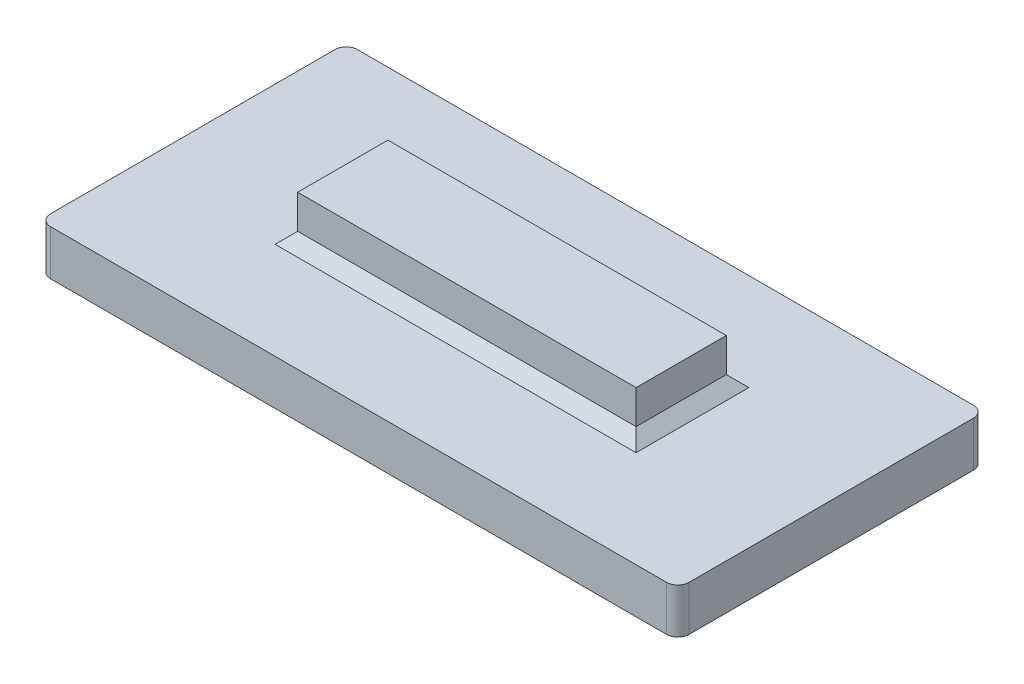
ISO-10303-21;
HEADER;
FILE_DESCRIPTION(('STEP AP214'),'2;1');
FILE_NAME('part.step','',(''),(''),'','','');
FILE_SCHEMA(('AUTOMOTIVE_DESIGN { 1 0 10303 214 1 1 1 1 }'));
ENDSEC;
DATA;
#1=APPLICATION_CONTEXT('core data for automotive mechanical design processes');
#2=APPLICATION_PROTOCOL_DEFINITION('international standard','automotive_design',2000,#1);
#3=PRODUCT_CONTEXT('',#1,'mechanical');
#4=PRODUCT('Part','Part','',(#3));
#5=PRODUCT_RELATED_PRODUCT_CATEGORY('part','',(#4));
#6=PRODUCT_DEFINITION_FORMATION('','',#4);
#7=PRODUCT_DEFINITION_CONTEXT('part definition',#1,'design');
#8=PRODUCT_DEFINITION('design','',#6,#7);
#9=PRODUCT_DEFINITION_SHAPE('','',#8);
#10=(LENGTH_UNIT() NAMED_UNIT(*) SI_UNIT(.MILLI.,.METRE.));
#11=(NAMED_UNIT(*) PLANE_ANGLE_UNIT() SI_UNIT($,.RADIAN.));
#12=(NAMED_UNIT(*) SI_UNIT($,.STERADIAN.) SOLID_ANGLE_UNIT());
#13=UNCERTAINTY_MEASURE_WITH_UNIT(LENGTH_MEASURE(1.E-05),#10,'distance_accuracy_value','');
#14=(GEOMETRIC_REPRESENTATION_CONTEXT(3) GLOBAL_UNCERTAINTY_ASSIGNED_CONTEXT((#13)) GLOBAL_UNIT_ASSIGNED_CONTEXT((#10,
#11,#12)) REPRESENTATION_CONTEXT('',''));
#15=CARTESIAN_POINT('',(0.,0.,0.));
#16=DIRECTION('',(0.,0.,1.));
#17=DIRECTION('',(1.,0.,0.));
#18=AXIS2_PLACEMENT_3D('',#15,#16,#17);
#19=CARTESIAN_POINT('',(0.,2.,0.));
#20=DIRECTION('',(0.,-1.,0.));
#21=DIRECTION('',(0.,0.,-1.));
#22=AXIS2_PLACEMENT_3D('',#19,#20,#21);
#23=PLANE('',#22);
#24=DIRECTION('',(-1.,0.,0.));
#25=VECTOR('',#24,1.);
#26=CARTESIAN_POINT('',(-7.5,2.,2.5));
#27=LINE('',#26,#25);
#28=CARTESIAN_POINT('',(8.,2.,2.5));
#29=VERTEX_POINT('',#28);
#30=CARTESIAN_POINT('',(-8.,2.,2.5));
#31=VERTEX_POINT('',#30);
#32=EDGE_CURVE('E226',#29,#31,#27,.T.);
#33=ORIENTED_EDGE('',*,*,#32,.T.);
#34=DIRECTION('',(0.,0.,-1.));
#35=VECTOR('',#34,1.);
#36=CARTESIAN_POINT('',(-8.,2.,-2.));
#37=LINE('',#36,#35);
#38=CARTESIAN_POINT('',(-8.,2.,-2.5));
#39=VERTEX_POINT('',#38);
#40=EDGE_CURVE('E228',#31,#39,#37,.T.);
#41=ORIENTED_EDGE('',*,*,#40,.T.);
#42=DIRECTION('',(1.,0.,0.));
#43=VECTOR('',#42,1.);
#44=CARTESIAN_POINT('',(7.5,2.,-2.5));
#45=LINE('',#44,#43);
#46=CARTESIAN_POINT('',(8.,2.,-2.5));
#47=VERTEX_POINT('',#46);
#48=EDGE_CURVE('E222',#39,#47,#45,.T.);
#49=ORIENTED_EDGE('',*,*,#48,.T.);
#50=DIRECTION('',(0.,0.,1.));
#51=VECTOR('',#50,1.);
#52=CARTESIAN_POINT('',(8.,2.,2.));
#53=LINE('',#52,#51);
#54=EDGE_CURVE('E224',#47,#29,#53,.T.);
#55=ORIENTED_EDGE('',*,*,#54,.T.);
#56=EDGE_LOOP('',(#33,#41,#49,#55));
#57=FACE_BOUND('',#56,.T.);
#58=DIRECTION('',(1.,0.,0.));
#59=VECTOR('',#58,1.);
#60=CARTESIAN_POINT('',(-14.15,2.,6.8));
#61=LINE('',#60,#59);
#62=CARTESIAN_POINT('',(-13.65,2.,6.8));
#63=VERTEX_POINT('',#62);
#64=CARTESIAN_POINT('',(13.65,2.,6.8));
#65=VERTEX_POINT('',#64);
#66=EDGE_CURVE('E173',#63,#65,#61,.T.);
#67=ORIENTED_EDGE('',*,*,#66,.T.);
#68=CARTESIAN_POINT('',(13.65,2.,6.3));
#69=DIRECTION('',(0.,-1.,0.));
#70=DIRECTION('',(0.,0.,-1.));
#71=AXIS2_PLACEMENT_3D('',#68,#69,#70);
#72=CIRCLE('',#71,0.5);
#73=CARTESIAN_POINT('',(14.15,2.,6.3));
#74=VERTEX_POINT('',#73);
#75=EDGE_CURVE('E207',#65,#74,#72,.F.);
#76=ORIENTED_EDGE('',*,*,#75,.T.);
#77=DIRECTION('',(0.,0.,-1.));
#78=VECTOR('',#77,1.);
#79=CARTESIAN_POINT('',(14.15,2.,6.8));
#80=LINE('',#79,#78);
#81=CARTESIAN_POINT('',(14.15,2.,-6.3));
#82=VERTEX_POINT('',#81);
#83=EDGE_CURVE('E170',#74,#82,#80,.T.);
#84=ORIENTED_EDGE('',*,*,#83,.T.);
#85=CARTESIAN_POINT('',(13.65,2.,-6.3));
#86=DIRECTION('',(0.,-1.,0.));
#87=DIRECTION('',(0.,0.,-1.));
#88=AXIS2_PLACEMENT_3D('',#85,#86,#87);
#89=CIRCLE('',#88,0.5);
#90=CARTESIAN_POINT('',(13.65,2.,-6.8));
#91=VERTEX_POINT('',#90);
#92=EDGE_CURVE('E201',#82,#91,#89,.F.);
#93=ORIENTED_EDGE('',*,*,#92,.T.);
#94=DIRECTION('',(1.,0.,0.));
#95=VECTOR('',#94,1.);
#96=CARTESIAN_POINT('',(-14.15,2.,-6.8));
#97=LINE('',#96,#95);
#98=CARTESIAN_POINT('',(-13.65,2.,-6.8));
#99=VERTEX_POINT('',#98);
#100=EDGE_CURVE('E166',#99,#91,#97,.T.);
#101=ORIENTED_EDGE('',*,*,#100,.F.);
#102=CARTESIAN_POINT('',(-13.65,2.,-6.3));
#103=DIRECTION('',(0.,-1.,0.));
#104=DIRECTION('',(0.,0.,-1.));
#105=AXIS2_PLACEMENT_3D('',#102,#103,#104);
#106=CIRCLE('',#105,0.5);
#107=CARTESIAN_POINT('',(-14.15,2.,-6.3));
#108=VERTEX_POINT('',#107);
#109=EDGE_CURVE('E203',#99,#108,#106,.F.);
#110=ORIENTED_EDGE('',*,*,#109,.T.);
#111=DIRECTION('',(0.,0.,-1.));
#112=VECTOR('',#111,1.);
#113=CARTESIAN_POINT('',(-14.15,2.,6.8));
#114=LINE('',#113,#112);
#115=CARTESIAN_POINT('',(-14.15,2.,6.3));
#116=VERTEX_POINT('',#115);
#117=EDGE_CURVE('E163',#116,#108,#114,.T.);
#118=ORIENTED_EDGE('',*,*,#117,.F.);
#119=CARTESIAN_POINT('',(-13.65,2.,6.3));
#120=DIRECTION('',(0.,-1.,0.));
#121=DIRECTION('',(0.,0.,-1.));
#122=AXIS2_PLACEMENT_3D('',#119,#120,#121);
#123=CIRCLE('',#122,0.5);
#124=EDGE_CURVE('E205',#116,#63,#123,.F.);
#125=ORIENTED_EDGE('',*,*,#124,.T.);
#126=EDGE_LOOP('',(#67,#76,#84,#93,#101,#110,#118,#125));
#127=FACE_BOUND('',#126,.T.);
#128=ADVANCED_FACE('F33',(#57,#127),#23,.F.);
#129=CARTESIAN_POINT('',(-14.15,2.,6.8));
#130=DIRECTION('',(-1.,0.,0.));
#131=DIRECTION('',(0.,0.,1.));
#132=AXIS2_PLACEMENT_3D('',#129,#130,#131);
#133=PLANE('',#132);
#134=DIRECTION('',(0.,0.,-1.));
#135=VECTOR('',#134,1.);
#136=CARTESIAN_POINT('',(-14.15,0.,6.8));
#137=LINE('',#136,#135);
#138=CARTESIAN_POINT('',(-14.15,0.,6.3));
#139=VERTEX_POINT('',#138);
#140=CARTESIAN_POINT('',(-14.15,0.,-6.3));
#141=VERTEX_POINT('',#140);
#142=EDGE_CURVE('E154',#139,#141,#137,.T.);
#143=ORIENTED_EDGE('',*,*,#142,.F.);
#144=DIRECTION('',(0.,-1.,0.));
#145=VECTOR('',#144,1.);
#146=CARTESIAN_POINT('',(-14.15,2.,6.3));
#147=LINE('',#146,#145);
#148=EDGE_CURVE('E212',#139,#116,#147,.F.);
#149=ORIENTED_EDGE('',*,*,#148,.T.);
#150=ORIENTED_EDGE('',*,*,#117,.T.);
#151=DIRECTION('',(0.,-1.,0.));
#152=VECTOR('',#151,1.);
#153=CARTESIAN_POINT('',(-14.15,2.,-6.3));
#154=LINE('',#153,#152);
#155=EDGE_CURVE('E209',#108,#141,#154,.T.);
#156=ORIENTED_EDGE('',*,*,#155,.T.);
#157=EDGE_LOOP('',(#143,#149,#150,#156));
#158=FACE_BOUND('',#157,.T.);
#159=ADVANCED_FACE('F274',(#158),#133,.T.);
#160=CARTESIAN_POINT('',(-14.15,2.,6.8));
#161=DIRECTION('',(0.,0.,-1.));
#162=DIRECTION('',(-1.,0.,0.));
#163=AXIS2_PLACEMENT_3D('',#160,#161,#162);
#164=PLANE('',#163);
#165=DIRECTION('',(1.,0.,0.));
#166=VECTOR('',#165,1.);
#167=CARTESIAN_POINT('',(-14.15,0.,6.8));
#168=LINE('',#167,#166);
#169=CARTESIAN_POINT('',(-13.65,0.,6.8));
#170=VERTEX_POINT('',#169);
#171=CARTESIAN_POINT('',(13.65,0.,6.8));
#172=VERTEX_POINT('',#171);
#173=EDGE_CURVE('E167',#170,#172,#168,.T.);
#174=ORIENTED_EDGE('',*,*,#173,.T.);
#175=DIRECTION('',(0.,-1.,0.));
#176=VECTOR('',#175,1.);
#177=CARTESIAN_POINT('',(13.65,2.,6.8));
#178=LINE('',#177,#176);
#179=EDGE_CURVE('E199',#172,#65,#178,.F.);
#180=ORIENTED_EDGE('',*,*,#179,.T.);
#181=ORIENTED_EDGE('',*,*,#66,.F.);
#182=DIRECTION('',(0.,-1.,0.));
#183=VECTOR('',#182,1.);
#184=CARTESIAN_POINT('',(-13.65,0.,6.8));
#185=LINE('',#184,#183);
#186=EDGE_CURVE('E196',#63,#170,#185,.T.);
#187=ORIENTED_EDGE('',*,*,#186,.T.);
#188=EDGE_LOOP('',(#174,#180,#181,#187));
#189=FACE_BOUND('',#188,.T.);
#190=ADVANCED_FACE('F279',(#189),#164,.F.);
#191=CARTESIAN_POINT('',(14.15,2.,6.8));
#192=DIRECTION('',(-1.,0.,0.));
#193=DIRECTION('',(0.,0.,1.));
#194=AXIS2_PLACEMENT_3D('',#191,#192,#193);
#195=PLANE('',#194);
#196=ORIENTED_EDGE('',*,*,#83,.F.);
#197=DIRECTION('',(0.,-1.,0.));
#198=VECTOR('',#197,1.);
#199=CARTESIAN_POINT('',(14.15,2.,6.3));
#200=LINE('',#199,#198);
#201=CARTESIAN_POINT('',(14.15,0.,6.3));
#202=VERTEX_POINT('',#201);
#203=EDGE_CURVE('E185',#74,#202,#200,.T.);
#204=ORIENTED_EDGE('',*,*,#203,.T.);
#205=DIRECTION('',(0.,0.,-1.));
#206=VECTOR('',#205,1.);
#207=CARTESIAN_POINT('',(14.15,0.,6.8));
#208=LINE('',#207,#206);
#209=CARTESIAN_POINT('',(14.15,0.,-6.3));
#210=VERTEX_POINT('',#209);
#211=EDGE_CURVE('E179',#202,#210,#208,.T.);
#212=ORIENTED_EDGE('',*,*,#211,.T.);
#213=DIRECTION('',(0.,-1.,0.));
#214=VECTOR('',#213,1.);
#215=CARTESIAN_POINT('',(14.15,2.,-6.3));
#216=LINE('',#215,#214);
#217=EDGE_CURVE('E175',#210,#82,#216,.F.);
#218=ORIENTED_EDGE('',*,*,#217,.T.);
#219=EDGE_LOOP('',(#196,#204,#212,#218));
#220=FACE_BOUND('',#219,.T.);
#221=ADVANCED_FACE('F293',(#220),#195,.F.);
#222=CARTESIAN_POINT('',(-14.15,2.,-6.8));
#223=DIRECTION('',(0.,0.,-1.));
#224=DIRECTION('',(-1.,0.,0.));
#225=AXIS2_PLACEMENT_3D('',#222,#223,#224);
#226=PLANE('',#225);
#227=DIRECTION('',(1.,0.,0.));
#228=VECTOR('',#227,1.);
#229=CARTESIAN_POINT('',(-14.15,0.,-6.8));
#230=LINE('',#229,#228);
#231=CARTESIAN_POINT('',(-13.65,0.,-6.8));
#232=VERTEX_POINT('',#231);
#233=CARTESIAN_POINT('',(13.65,0.,-6.8));
#234=VERTEX_POINT('',#233);
#235=EDGE_CURVE('E157',#232,#234,#230,.T.);
#236=ORIENTED_EDGE('',*,*,#235,.F.);
#237=DIRECTION('',(0.,-1.,0.));
#238=VECTOR('',#237,1.);
#239=CARTESIAN_POINT('',(-13.65,2.,-6.8));
#240=LINE('',#239,#238);
#241=EDGE_CURVE('E217',#232,#99,#240,.F.);
#242=ORIENTED_EDGE('',*,*,#241,.T.);
#243=ORIENTED_EDGE('',*,*,#100,.T.);
#244=DIRECTION('',(0.,-1.,0.));
#245=VECTOR('',#244,1.);
#246=CARTESIAN_POINT('',(13.65,0.,-6.8));
#247=LINE('',#246,#245);
#248=EDGE_CURVE('E214',#91,#234,#247,.T.);
#249=ORIENTED_EDGE('',*,*,#248,.T.);
#250=EDGE_LOOP('',(#236,#242,#243,#249));
#251=FACE_BOUND('',#250,.T.);
#252=ADVANCED_FACE('F289',(#251),#226,.T.);
#253=CARTESIAN_POINT('',(0.,0.,0.));
#254=DIRECTION('',(0.,-1.,0.));
#255=DIRECTION('',(0.,0.,-1.));
#256=AXIS2_PLACEMENT_3D('',#253,#254,#255);
#257=PLANE('',#256);
#258=ORIENTED_EDGE('',*,*,#211,.F.);
#259=CARTESIAN_POINT('',(13.65,0.,6.3));
#260=DIRECTION('',(0.,-1.,0.));
#261=DIRECTION('',(0.,0.,-1.));
#262=AXIS2_PLACEMENT_3D('',#259,#260,#261);
#263=CIRCLE('',#262,0.5);
#264=EDGE_CURVE('E194',#202,#172,#263,.T.);
#265=ORIENTED_EDGE('',*,*,#264,.T.);
#266=ORIENTED_EDGE('',*,*,#173,.F.);
#267=CARTESIAN_POINT('',(-13.65,0.,6.3));
#268=DIRECTION('',(0.,-1.,0.));
#269=DIRECTION('',(0.,0.,-1.));
#270=AXIS2_PLACEMENT_3D('',#267,#268,#269);
#271=CIRCLE('',#270,0.5);
#272=EDGE_CURVE('E192',#170,#139,#271,.T.);
#273=ORIENTED_EDGE('',*,*,#272,.T.);
#274=ORIENTED_EDGE('',*,*,#142,.T.);
#275=CARTESIAN_POINT('',(-13.65,0.,-6.3));
#276=DIRECTION('',(0.,-1.,0.));
#277=DIRECTION('',(0.,0.,-1.));
#278=AXIS2_PLACEMENT_3D('',#275,#276,#277);
#279=CIRCLE('',#278,0.5);
#280=EDGE_CURVE('E190',#141,#232,#279,.T.);
#281=ORIENTED_EDGE('',*,*,#280,.T.);
#282=ORIENTED_EDGE('',*,*,#235,.T.);
#283=CARTESIAN_POINT('',(13.65,0.,-6.3));
#284=DIRECTION('',(0.,-1.,0.));
#285=DIRECTION('',(0.,0.,-1.));
#286=AXIS2_PLACEMENT_3D('',#283,#284,#285);
#287=CIRCLE('',#286,0.5);
#288=EDGE_CURVE('E188',#234,#210,#287,.T.);
#289=ORIENTED_EDGE('',*,*,#288,.T.);
#290=EDGE_LOOP('',(#258,#265,#266,#273,#274,#281,#282,#289));
#291=FACE_BOUND('',#290,.T.);
#292=ADVANCED_FACE('F285',(#291),#257,.T.);
#293=CARTESIAN_POINT('',(13.65,2.,6.3));
#294=DIRECTION('',(0.,-1.,0.));
#295=DIRECTION('',(0.,0.,-1.));
#296=AXIS2_PLACEMENT_3D('',#293,#294,#295);
#297=CYLINDRICAL_SURFACE('',#296,0.5);
#298=ORIENTED_EDGE('',*,*,#75,.F.);
#299=ORIENTED_EDGE('',*,*,#179,.F.);
#300=ORIENTED_EDGE('',*,*,#264,.F.);
#301=ORIENTED_EDGE('',*,*,#203,.F.);
#302=EDGE_LOOP('',(#298,#299,#300,#301));
#303=FACE_BOUND('',#302,.T.);
#304=ADVANCED_FACE('F288',(#303),#297,.T.);
#305=CARTESIAN_POINT('',(-13.65,2.,6.3));
#306=DIRECTION('',(0.,1.,0.));
#307=DIRECTION('',(0.,0.,1.));
#308=AXIS2_PLACEMENT_3D('',#305,#306,#307);
#309=CYLINDRICAL_SURFACE('',#308,0.5);
#310=ORIENTED_EDGE('',*,*,#124,.F.);
#311=ORIENTED_EDGE('',*,*,#148,.F.);
#312=ORIENTED_EDGE('',*,*,#272,.F.);
#313=ORIENTED_EDGE('',*,*,#186,.F.);
#314=EDGE_LOOP('',(#310,#311,#312,#313));
#315=FACE_BOUND('',#314,.T.);
#316=ADVANCED_FACE('F303',(#315),#309,.T.);
#317=CARTESIAN_POINT('',(-13.65,2.,-6.3));
#318=DIRECTION('',(0.,-1.,0.));
#319=DIRECTION('',(0.,0.,-1.));
#320=AXIS2_PLACEMENT_3D('',#317,#318,#319);
#321=CYLINDRICAL_SURFACE('',#320,0.5);
#322=ORIENTED_EDGE('',*,*,#109,.F.);
#323=ORIENTED_EDGE('',*,*,#241,.F.);
#324=ORIENTED_EDGE('',*,*,#280,.F.);
#325=ORIENTED_EDGE('',*,*,#155,.F.);
#326=EDGE_LOOP('',(#322,#323,#324,#325));
#327=FACE_BOUND('',#326,.T.);
#328=ADVANCED_FACE('F307',(#327),#321,.T.);
#329=CARTESIAN_POINT('',(13.65,2.,-6.3));
#330=DIRECTION('',(0.,1.,0.));
#331=DIRECTION('',(0.,0.,1.));
#332=AXIS2_PLACEMENT_3D('',#329,#330,#331);
#333=CYLINDRICAL_SURFACE('',#332,0.5);
#334=ORIENTED_EDGE('',*,*,#92,.F.);
#335=ORIENTED_EDGE('',*,*,#217,.F.);
#336=ORIENTED_EDGE('',*,*,#288,.F.);
#337=ORIENTED_EDGE('',*,*,#248,.F.);
#338=EDGE_LOOP('',(#334,#335,#336,#337));
#339=FACE_BOUND('',#338,.T.);
#340=ADVANCED_FACE('F311',(#339),#333,.T.);
#341=CARTESIAN_POINT('',(7.5,4.,2.));
#342=DIRECTION('',(-1.,0.,0.));
#343=DIRECTION('',(0.,0.,1.));
#344=AXIS2_PLACEMENT_3D('',#341,#342,#343);
#345=PLANE('',#344);
#346=DIRECTION('',(0.,-1.,0.));
#347=VECTOR('',#346,1.);
#348=CARTESIAN_POINT('',(7.5,4.,2.));
#349=LINE('',#348,#347);
#350=CARTESIAN_POINT('',(7.5,4.,2.));
#351=VERTEX_POINT('',#350);
#352=CARTESIAN_POINT('',(7.5,2.5,2.));
#353=VERTEX_POINT('',#352);
#354=EDGE_CURVE('E261',#351,#353,#349,.T.);
#355=ORIENTED_EDGE('',*,*,#354,.T.);
#356=DIRECTION('',(0.,0.,-1.));
#357=VECTOR('',#356,1.);
#358=CARTESIAN_POINT('',(7.5,2.5,-2.));
#359=LINE('',#358,#357);
#360=CARTESIAN_POINT('',(7.5,2.5,-2.));
#361=VERTEX_POINT('',#360);
#362=EDGE_CURVE('E42',#353,#361,#359,.T.);
#363=ORIENTED_EDGE('',*,*,#362,.T.);
#364=DIRECTION('',(0.,-1.,0.));
#365=VECTOR('',#364,1.);
#366=CARTESIAN_POINT('',(7.5,4.,-2.));
#367=LINE('',#366,#365);
#368=CARTESIAN_POINT('',(7.5,4.,-2.));
#369=VERTEX_POINT('',#368);
#370=EDGE_CURVE('E139',#369,#361,#367,.T.);
#371=ORIENTED_EDGE('',*,*,#370,.F.);
#372=DIRECTION('',(0.,0.,-1.));
#373=VECTOR('',#372,1.);
#374=CARTESIAN_POINT('',(7.5,4.,2.));
#375=LINE('',#374,#373);
#376=EDGE_CURVE('E146',#351,#369,#375,.T.);
#377=ORIENTED_EDGE('',*,*,#376,.F.);
#378=EDGE_LOOP('',(#355,#363,#371,#377));
#379=FACE_BOUND('',#378,.T.);
#380=ADVANCED_FACE('F153',(#379),#345,.F.);
#381=CARTESIAN_POINT('',(-7.5,4.,-2.));
#382=DIRECTION('',(0.,0.,1.));
#383=DIRECTION('',(1.,0.,0.));
#384=AXIS2_PLACEMENT_3D('',#381,#382,#383);
#385=PLANE('',#384);
#386=ORIENTED_EDGE('',*,*,#370,.T.);
#387=DIRECTION('',(-1.,0.,0.));
#388=VECTOR('',#387,1.);
#389=CARTESIAN_POINT('',(-7.5,2.5,-2.));
#390=LINE('',#389,#388);
#391=CARTESIAN_POINT('',(-7.5,2.5,-2.));
#392=VERTEX_POINT('',#391);
#393=EDGE_CURVE('E11',#361,#392,#390,.T.);
#394=ORIENTED_EDGE('',*,*,#393,.T.);
#395=DIRECTION('',(0.,-1.,0.));
#396=VECTOR('',#395,1.);
#397=CARTESIAN_POINT('',(-7.5,4.,-2.));
#398=LINE('',#397,#396);
#399=CARTESIAN_POINT('',(-7.5,4.,-2.));
#400=VERTEX_POINT('',#399);
#401=EDGE_CURVE('E142',#400,#392,#398,.T.);
#402=ORIENTED_EDGE('',*,*,#401,.F.);
#403=DIRECTION('',(-1.,0.,0.));
#404=VECTOR('',#403,1.);
#405=CARTESIAN_POINT('',(-7.5,4.,-2.));
#406=LINE('',#405,#404);
#407=EDGE_CURVE('E136',#369,#400,#406,.T.);
#408=ORIENTED_EDGE('',*,*,#407,.F.);
#409=EDGE_LOOP('',(#386,#394,#402,#408));
#410=FACE_BOUND('',#409,.T.);
#411=ADVANCED_FACE('F138',(#410),#385,.F.);
#412=CARTESIAN_POINT('',(-7.5,4.,2.));
#413=DIRECTION('',(1.,0.,0.));
#414=DIRECTION('',(0.,0.,-1.));
#415=AXIS2_PLACEMENT_3D('',#412,#413,#414);
#416=PLANE('',#415);
#417=ORIENTED_EDGE('',*,*,#401,.T.);
#418=DIRECTION('',(0.,0.,1.));
#419=VECTOR('',#418,1.);
#420=CARTESIAN_POINT('',(-7.5,2.5,2.));
#421=LINE('',#420,#419);
#422=CARTESIAN_POINT('',(-7.5,2.5,2.));
#423=VERTEX_POINT('',#422);
#424=EDGE_CURVE('E219',#392,#423,#421,.T.);
#425=ORIENTED_EDGE('',*,*,#424,.T.);
#426=DIRECTION('',(0.,-1.,0.));
#427=VECTOR('',#426,1.);
#428=CARTESIAN_POINT('',(-7.5,4.,2.));
#429=LINE('',#428,#427);
#430=CARTESIAN_POINT('',(-7.5,4.,2.));
#431=VERTEX_POINT('',#430);
#432=EDGE_CURVE('E159',#431,#423,#429,.T.);
#433=ORIENTED_EDGE('',*,*,#432,.F.);
#434=DIRECTION('',(0.,0.,1.));
#435=VECTOR('',#434,1.);
#436=CARTESIAN_POINT('',(-7.5,4.,2.));
#437=LINE('',#436,#435);
#438=EDGE_CURVE('E145',#400,#431,#437,.T.);
#439=ORIENTED_EDGE('',*,*,#438,.F.);
#440=EDGE_LOOP('',(#417,#425,#433,#439));
#441=FACE_BOUND('',#440,.T.);
#442=ADVANCED_FACE('F259',(#441),#416,.F.);
#443=CARTESIAN_POINT('',(-7.5,4.,2.));
#444=DIRECTION('',(0.,0.,-1.));
#445=DIRECTION('',(-1.,0.,0.));
#446=AXIS2_PLACEMENT_3D('',#443,#444,#445);
#447=PLANE('',#446);
#448=ORIENTED_EDGE('',*,*,#432,.T.);
#449=DIRECTION('',(1.,0.,0.));
#450=VECTOR('',#449,1.);
#451=CARTESIAN_POINT('',(7.5,2.5,2.));
#452=LINE('',#451,#450);
#453=EDGE_CURVE('E57',#423,#353,#452,.T.);
#454=ORIENTED_EDGE('',*,*,#453,.T.);
#455=ORIENTED_EDGE('',*,*,#354,.F.);
#456=DIRECTION('',(1.,0.,0.));
#457=VECTOR('',#456,1.);
#458=CARTESIAN_POINT('',(-7.5,4.,2.));
#459=LINE('',#458,#457);
#460=EDGE_CURVE('E151',#431,#351,#459,.T.);
#461=ORIENTED_EDGE('',*,*,#460,.F.);
#462=EDGE_LOOP('',(#448,#454,#455,#461));
#463=FACE_BOUND('',#462,.T.);
#464=ADVANCED_FACE('F260',(#463),#447,.F.);
#465=CARTESIAN_POINT('',(0.,4.,0.));
#466=DIRECTION('',(0.,-1.,0.));
#467=DIRECTION('',(0.,0.,-1.));
#468=AXIS2_PLACEMENT_3D('',#465,#466,#467);
#469=PLANE('',#468);
#470=ORIENTED_EDGE('',*,*,#376,.T.);
#471=ORIENTED_EDGE('',*,*,#407,.T.);
#472=ORIENTED_EDGE('',*,*,#438,.T.);
#473=ORIENTED_EDGE('',*,*,#460,.T.);
#474=EDGE_LOOP('',(#470,#471,#472,#473));
#475=FACE_BOUND('',#474,.T.);
#476=ADVANCED_FACE('F149',(#475),#469,.F.);
#477=CARTESIAN_POINT('',(7.5,2.5,2.));
#478=DIRECTION('',(0.707106781186549,0.707106781186546,0.));
#479=DIRECTION('',(0.,0.,1.));
#480=AXIS2_PLACEMENT_3D('',#477,#478,#479);
#481=PLANE('',#480);
#482=DIRECTION('',(0.577350269189625,-0.577350269189628,0.577350269189624));
#483=VECTOR('',#482,1.);
#484=CARTESIAN_POINT('',(7.5,2.5,2.));
#485=LINE('',#484,#483);
#486=EDGE_CURVE('E236',#29,#353,#485,.F.);
#487=ORIENTED_EDGE('',*,*,#486,.F.);
#488=ORIENTED_EDGE('',*,*,#54,.F.);
#489=DIRECTION('',(0.577350269189625,-0.577350269189628,-0.577350269189624));
#490=VECTOR('',#489,1.);
#491=CARTESIAN_POINT('',(2.50000000000001,7.50000000000001,2.99999999999998));
#492=LINE('',#491,#490);
#493=EDGE_CURVE('E37',#361,#47,#492,.T.);
#494=ORIENTED_EDGE('',*,*,#493,.F.);
#495=ORIENTED_EDGE('',*,*,#362,.F.);
#496=EDGE_LOOP('',(#487,#488,#494,#495));
#497=FACE_BOUND('',#496,.T.);
#498=ADVANCED_FACE('F35',(#497),#481,.T.);
#499=CARTESIAN_POINT('',(-7.5,2.5,-2.));
#500=DIRECTION('',(0.,0.707106781186545,-0.70710678118655));
#501=DIRECTION('',(1.,0.,0.));
#502=AXIS2_PLACEMENT_3D('',#499,#500,#501);
#503=PLANE('',#502);
#504=ORIENTED_EDGE('',*,*,#493,.T.);
#505=ORIENTED_EDGE('',*,*,#48,.F.);
#506=DIRECTION('',(0.577350269189624,0.577350269189629,0.577350269189625));
#507=VECTOR('',#506,1.);
#508=CARTESIAN_POINT('',(-7.5,2.5,-2.));
#509=LINE('',#508,#507);
#510=EDGE_CURVE('E235',#392,#39,#509,.F.);
#511=ORIENTED_EDGE('',*,*,#510,.F.);
#512=ORIENTED_EDGE('',*,*,#393,.F.);
#513=EDGE_LOOP('',(#504,#505,#511,#512));
#514=FACE_BOUND('',#513,.T.);
#515=ADVANCED_FACE('F245',(#514),#503,.T.);
#516=CARTESIAN_POINT('',(-7.5,2.5,2.));
#517=DIRECTION('',(0.,0.707106781186545,0.70710678118655));
#518=DIRECTION('',(-1.,0.,0.));
#519=AXIS2_PLACEMENT_3D('',#516,#517,#518);
#520=PLANE('',#519);
#521=ORIENTED_EDGE('',*,*,#486,.T.);
#522=ORIENTED_EDGE('',*,*,#453,.F.);
#523=DIRECTION('',(-0.577350269189624,-0.577350269189629,0.577350269189625));
#524=VECTOR('',#523,1.);
#525=CARTESIAN_POINT('',(-7.5,2.5,2.));
#526=LINE('',#525,#524);
#527=EDGE_CURVE('E233',#31,#423,#526,.F.);
#528=ORIENTED_EDGE('',*,*,#527,.F.);
#529=ORIENTED_EDGE('',*,*,#32,.F.);
#530=EDGE_LOOP('',(#521,#522,#528,#529));
#531=FACE_BOUND('',#530,.T.);
#532=ADVANCED_FACE('F256',(#531),#520,.T.);
#533=CARTESIAN_POINT('',(-7.5,2.5,2.));
#534=DIRECTION('',(-0.707106781186551,0.707106781186544,0.));
#535=DIRECTION('',(0.,0.,-1.));
#536=AXIS2_PLACEMENT_3D('',#533,#534,#535);
#537=PLANE('',#536);
#538=ORIENTED_EDGE('',*,*,#510,.T.);
#539=ORIENTED_EDGE('',*,*,#40,.F.);
#540=ORIENTED_EDGE('',*,*,#527,.T.);
#541=ORIENTED_EDGE('',*,*,#424,.F.);
#542=EDGE_LOOP('',(#538,#539,#540,#541));
#543=FACE_BOUND('',#542,.T.);
#544=ADVANCED_FACE('F254',(#543),#537,.T.);
#545=CLOSED_SHELL('',(#128,#159,#190,#221,#252,#292,#304,#316,#328,#340,#380,#411,#442,#464,
#476,#498,#515,#532,#544));
#546=MANIFOLD_SOLID_BREP('B2',#545);
#547=ADVANCED_BREP_SHAPE_REPRESENTATION('',(#18,#546),#14);
#548=SHAPE_DEFINITION_REPRESENTATION(#9,#547);
ENDSEC;
END-ISO-10303-21;
